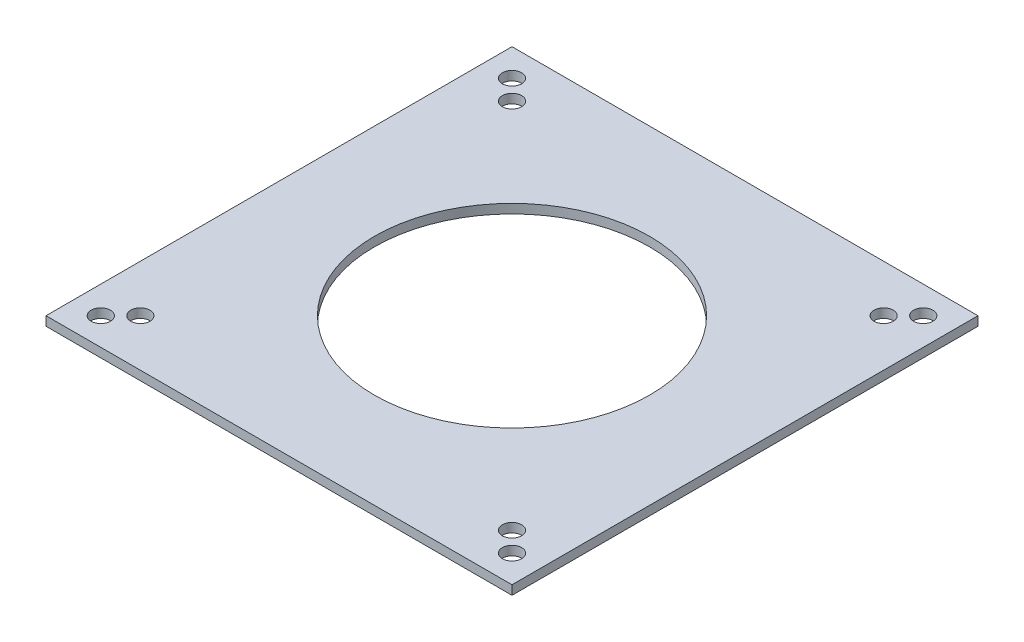
ISO-10303-21;
HEADER;
FILE_DESCRIPTION(('STEP AP214'),'2;1');
FILE_NAME('part.step','',(''),(''),'','','');
FILE_SCHEMA(('AUTOMOTIVE_DESIGN { 1 0 10303 214 1 1 1 1 }'));
ENDSEC;
DATA;
#1=APPLICATION_CONTEXT('core data for automotive mechanical design processes');
#2=APPLICATION_PROTOCOL_DEFINITION('international standard','automotive_design',2000,#1);
#3=PRODUCT_CONTEXT('',#1,'mechanical');
#4=PRODUCT('Part','Part','',(#3));
#5=PRODUCT_RELATED_PRODUCT_CATEGORY('part','',(#4));
#6=PRODUCT_DEFINITION_FORMATION('','',#4);
#7=PRODUCT_DEFINITION_CONTEXT('part definition',#1,'design');
#8=PRODUCT_DEFINITION('design','',#6,#7);
#9=PRODUCT_DEFINITION_SHAPE('','',#8);
#10=(LENGTH_UNIT() NAMED_UNIT(*) SI_UNIT(.MILLI.,.METRE.));
#11=(NAMED_UNIT(*) PLANE_ANGLE_UNIT() SI_UNIT($,.RADIAN.));
#12=(NAMED_UNIT(*) SI_UNIT($,.STERADIAN.) SOLID_ANGLE_UNIT());
#13=UNCERTAINTY_MEASURE_WITH_UNIT(LENGTH_MEASURE(1.E-05),#10,'distance_accuracy_value','');
#14=(GEOMETRIC_REPRESENTATION_CONTEXT(3) GLOBAL_UNCERTAINTY_ASSIGNED_CONTEXT((#13)) GLOBAL_UNIT_ASSIGNED_CONTEXT((#10,
#11,#12)) REPRESENTATION_CONTEXT('',''));
#15=CARTESIAN_POINT('',(0.,0.,0.));
#16=DIRECTION('',(0.,0.,1.));
#17=DIRECTION('',(1.,0.,0.));
#18=AXIS2_PLACEMENT_3D('',#15,#16,#17);
#19=CARTESIAN_POINT('',(0.,2.,0.));
#20=DIRECTION('',(0.,-1.,0.));
#21=DIRECTION('',(0.,0.,-1.));
#22=AXIS2_PLACEMENT_3D('',#19,#20,#21);
#23=PLANE('',#22);
#24=DIRECTION('',(0.,0.,-1.));
#25=VECTOR('',#24,1.);
#26=CARTESIAN_POINT('',(50.8,2.,50.8));
#27=LINE('',#26,#25);
#28=CARTESIAN_POINT('',(50.8,2.,50.8));
#29=VERTEX_POINT('',#28);
#30=CARTESIAN_POINT('',(50.8,2.,-50.8));
#31=VERTEX_POINT('',#30);
#32=EDGE_CURVE('E88',#29,#31,#27,.T.);
#33=ORIENTED_EDGE('',*,*,#32,.T.);
#34=DIRECTION('',(-1.,0.,0.));
#35=VECTOR('',#34,1.);
#36=CARTESIAN_POINT('',(-50.8,2.,-50.8));
#37=LINE('',#36,#35);
#38=CARTESIAN_POINT('',(-50.8,2.,-50.8));
#39=VERTEX_POINT('',#38);
#40=EDGE_CURVE('E83',#31,#39,#37,.T.);
#41=ORIENTED_EDGE('',*,*,#40,.T.);
#42=DIRECTION('',(0.,0.,1.));
#43=VECTOR('',#42,1.);
#44=CARTESIAN_POINT('',(-50.8,2.,50.8));
#45=LINE('',#44,#43);
#46=CARTESIAN_POINT('',(-50.8,2.,50.8));
#47=VERTEX_POINT('',#46);
#48=EDGE_CURVE('E86',#39,#47,#45,.T.);
#49=ORIENTED_EDGE('',*,*,#48,.T.);
#50=DIRECTION('',(1.,0.,0.));
#51=VECTOR('',#50,1.);
#52=CARTESIAN_POINT('',(-50.8,2.,50.8));
#53=LINE('',#52,#51);
#54=EDGE_CURVE('E53',#47,#29,#53,.T.);
#55=ORIENTED_EDGE('',*,*,#54,.T.);
#56=EDGE_LOOP('',(#33,#41,#49,#55));
#57=FACE_BOUND('',#56,.T.);
#58=CARTESIAN_POINT('',(-44.831,2.,-44.831));
#59=DIRECTION('',(0.,1.,0.));
#60=DIRECTION('',(0.,0.,1.));
#61=AXIS2_PLACEMENT_3D('',#58,#59,#60);
#62=CIRCLE('',#61,2.1);
#63=CARTESIAN_POINT('',(-44.831,2.,-42.731));
#64=VERTEX_POINT('',#63);
#65=EDGE_CURVE('E103',#64,#64,#62,.T.);
#66=ORIENTED_EDGE('',*,*,#65,.F.);
#67=EDGE_LOOP('',(#66));
#68=FACE_BOUND('',#67,.T.);
#69=CARTESIAN_POINT('',(-40.513,2.,-40.513));
#70=DIRECTION('',(0.,1.,0.));
#71=DIRECTION('',(0.,0.,1.));
#72=AXIS2_PLACEMENT_3D('',#69,#70,#71);
#73=CIRCLE('',#72,2.1);
#74=CARTESIAN_POINT('',(-40.513,2.,-38.413));
#75=VERTEX_POINT('',#74);
#76=EDGE_CURVE('E118',#75,#75,#73,.T.);
#77=ORIENTED_EDGE('',*,*,#76,.F.);
#78=EDGE_LOOP('',(#77));
#79=FACE_BOUND('',#78,.T.);
#80=CARTESIAN_POINT('',(44.831,2.,-44.831));
#81=DIRECTION('',(0.,1.,0.));
#82=DIRECTION('',(0.,0.,1.));
#83=AXIS2_PLACEMENT_3D('',#80,#81,#82);
#84=CIRCLE('',#83,2.1);
#85=CARTESIAN_POINT('',(44.831,2.,-42.731));
#86=VERTEX_POINT('',#85);
#87=EDGE_CURVE('E124',#86,#86,#84,.T.);
#88=ORIENTED_EDGE('',*,*,#87,.F.);
#89=EDGE_LOOP('',(#88));
#90=FACE_BOUND('',#89,.T.);
#91=CARTESIAN_POINT('',(40.513,2.,-40.513));
#92=DIRECTION('',(0.,1.,0.));
#93=DIRECTION('',(0.,0.,1.));
#94=AXIS2_PLACEMENT_3D('',#91,#92,#93);
#95=CIRCLE('',#94,2.1);
#96=CARTESIAN_POINT('',(40.513,2.,-38.413));
#97=VERTEX_POINT('',#96);
#98=EDGE_CURVE('E130',#97,#97,#95,.T.);
#99=ORIENTED_EDGE('',*,*,#98,.F.);
#100=EDGE_LOOP('',(#99));
#101=FACE_BOUND('',#100,.T.);
#102=CARTESIAN_POINT('',(44.831,2.,44.831));
#103=DIRECTION('',(0.,1.,0.));
#104=DIRECTION('',(0.,0.,1.));
#105=AXIS2_PLACEMENT_3D('',#102,#103,#104);
#106=CIRCLE('',#105,2.1);
#107=CARTESIAN_POINT('',(44.831,2.,46.931));
#108=VERTEX_POINT('',#107);
#109=EDGE_CURVE('E136',#108,#108,#106,.T.);
#110=ORIENTED_EDGE('',*,*,#109,.F.);
#111=EDGE_LOOP('',(#110));
#112=FACE_BOUND('',#111,.T.);
#113=CARTESIAN_POINT('',(40.513,2.,40.513));
#114=DIRECTION('',(0.,1.,0.));
#115=DIRECTION('',(0.,0.,1.));
#116=AXIS2_PLACEMENT_3D('',#113,#114,#115);
#117=CIRCLE('',#116,2.1);
#118=CARTESIAN_POINT('',(40.513,2.,42.613));
#119=VERTEX_POINT('',#118);
#120=EDGE_CURVE('E142',#119,#119,#117,.T.);
#121=ORIENTED_EDGE('',*,*,#120,.F.);
#122=EDGE_LOOP('',(#121));
#123=FACE_BOUND('',#122,.T.);
#124=CARTESIAN_POINT('',(-40.513,2.,40.513));
#125=DIRECTION('',(0.,1.,0.));
#126=DIRECTION('',(0.,0.,1.));
#127=AXIS2_PLACEMENT_3D('',#124,#125,#126);
#128=CIRCLE('',#127,2.1);
#129=CARTESIAN_POINT('',(-40.513,2.,42.613));
#130=VERTEX_POINT('',#129);
#131=EDGE_CURVE('E148',#130,#130,#128,.T.);
#132=ORIENTED_EDGE('',*,*,#131,.F.);
#133=EDGE_LOOP('',(#132));
#134=FACE_BOUND('',#133,.T.);
#135=CARTESIAN_POINT('',(-44.831,2.,44.831));
#136=DIRECTION('',(0.,1.,0.));
#137=DIRECTION('',(0.,0.,1.));
#138=AXIS2_PLACEMENT_3D('',#135,#136,#137);
#139=CIRCLE('',#138,2.1);
#140=CARTESIAN_POINT('',(-44.831,2.,46.931));
#141=VERTEX_POINT('',#140);
#142=EDGE_CURVE('E154',#141,#141,#139,.T.);
#143=ORIENTED_EDGE('',*,*,#142,.F.);
#144=EDGE_LOOP('',(#143));
#145=FACE_BOUND('',#144,.T.);
#146=CARTESIAN_POINT('',(0.,2.,0.));
#147=DIRECTION('',(0.,1.,0.));
#148=DIRECTION('',(0.,0.,1.));
#149=AXIS2_PLACEMENT_3D('',#146,#147,#148);
#150=CIRCLE('',#149,30.);
#151=CARTESIAN_POINT('',(0.,2.,30.));
#152=VERTEX_POINT('',#151);
#153=EDGE_CURVE('E160',#152,#152,#150,.T.);
#154=ORIENTED_EDGE('',*,*,#153,.F.);
#155=EDGE_LOOP('',(#154));
#156=FACE_BOUND('',#155,.T.);
#157=ADVANCED_FACE('F36',(#57,#68,#79,#90,#101,#112,#123,#134,#145,#156),#23,.F.);
#158=CARTESIAN_POINT('',(0.,0.,0.));
#159=DIRECTION('',(0.,-1.,0.));
#160=DIRECTION('',(0.,0.,-1.));
#161=AXIS2_PLACEMENT_3D('',#158,#159,#160);
#162=PLANE('',#161);
#163=CARTESIAN_POINT('',(-44.831,0.,44.831));
#164=DIRECTION('',(0.,1.,0.));
#165=DIRECTION('',(0.,0.,1.));
#166=AXIS2_PLACEMENT_3D('',#163,#164,#165);
#167=CIRCLE('',#166,2.1);
#168=CARTESIAN_POINT('',(-44.831,0.,46.931));
#169=VERTEX_POINT('',#168);
#170=EDGE_CURVE('E157',#169,#169,#167,.T.);
#171=ORIENTED_EDGE('',*,*,#170,.T.);
#172=EDGE_LOOP('',(#171));
#173=FACE_BOUND('',#172,.T.);
#174=CARTESIAN_POINT('',(40.513,0.,40.513));
#175=DIRECTION('',(0.,1.,0.));
#176=DIRECTION('',(0.,0.,1.));
#177=AXIS2_PLACEMENT_3D('',#174,#175,#176);
#178=CIRCLE('',#177,2.1);
#179=CARTESIAN_POINT('',(40.513,0.,42.613));
#180=VERTEX_POINT('',#179);
#181=EDGE_CURVE('E145',#180,#180,#178,.T.);
#182=ORIENTED_EDGE('',*,*,#181,.T.);
#183=EDGE_LOOP('',(#182));
#184=FACE_BOUND('',#183,.T.);
#185=CARTESIAN_POINT('',(40.513,0.,-40.513));
#186=DIRECTION('',(0.,1.,0.));
#187=DIRECTION('',(0.,0.,1.));
#188=AXIS2_PLACEMENT_3D('',#185,#186,#187);
#189=CIRCLE('',#188,2.1);
#190=CARTESIAN_POINT('',(40.513,0.,-38.413));
#191=VERTEX_POINT('',#190);
#192=EDGE_CURVE('E133',#191,#191,#189,.T.);
#193=ORIENTED_EDGE('',*,*,#192,.T.);
#194=EDGE_LOOP('',(#193));
#195=FACE_BOUND('',#194,.T.);
#196=CARTESIAN_POINT('',(-40.513,0.,-40.513));
#197=DIRECTION('',(0.,1.,0.));
#198=DIRECTION('',(0.,0.,1.));
#199=AXIS2_PLACEMENT_3D('',#196,#197,#198);
#200=CIRCLE('',#199,2.1);
#201=CARTESIAN_POINT('',(-40.513,0.,-38.413));
#202=VERTEX_POINT('',#201);
#203=EDGE_CURVE('E121',#202,#202,#200,.T.);
#204=ORIENTED_EDGE('',*,*,#203,.T.);
#205=EDGE_LOOP('',(#204));
#206=FACE_BOUND('',#205,.T.);
#207=DIRECTION('',(0.,0.,-1.));
#208=VECTOR('',#207,1.);
#209=CARTESIAN_POINT('',(50.8,0.,50.8));
#210=LINE('',#209,#208);
#211=CARTESIAN_POINT('',(50.8,0.,50.8));
#212=VERTEX_POINT('',#211);
#213=CARTESIAN_POINT('',(50.8,0.,-50.8));
#214=VERTEX_POINT('',#213);
#215=EDGE_CURVE('E100',#212,#214,#210,.T.);
#216=ORIENTED_EDGE('',*,*,#215,.F.);
#217=DIRECTION('',(1.,0.,0.));
#218=VECTOR('',#217,1.);
#219=CARTESIAN_POINT('',(-50.8,0.,50.8));
#220=LINE('',#219,#218);
#221=CARTESIAN_POINT('',(-50.8,0.,50.8));
#222=VERTEX_POINT('',#221);
#223=EDGE_CURVE('E76',#222,#212,#220,.T.);
#224=ORIENTED_EDGE('',*,*,#223,.F.);
#225=DIRECTION('',(0.,0.,1.));
#226=VECTOR('',#225,1.);
#227=CARTESIAN_POINT('',(-50.8,0.,50.8));
#228=LINE('',#227,#226);
#229=CARTESIAN_POINT('',(-50.8,0.,-50.8));
#230=VERTEX_POINT('',#229);
#231=EDGE_CURVE('E70',#230,#222,#228,.T.);
#232=ORIENTED_EDGE('',*,*,#231,.F.);
#233=DIRECTION('',(-1.,0.,0.));
#234=VECTOR('',#233,1.);
#235=CARTESIAN_POINT('',(-50.8,0.,-50.8));
#236=LINE('',#235,#234);
#237=EDGE_CURVE('E92',#214,#230,#236,.T.);
#238=ORIENTED_EDGE('',*,*,#237,.F.);
#239=EDGE_LOOP('',(#216,#224,#232,#238));
#240=FACE_BOUND('',#239,.T.);
#241=CARTESIAN_POINT('',(-44.831,0.,-44.831));
#242=DIRECTION('',(0.,1.,0.));
#243=DIRECTION('',(0.,0.,1.));
#244=AXIS2_PLACEMENT_3D('',#241,#242,#243);
#245=CIRCLE('',#244,2.1);
#246=CARTESIAN_POINT('',(-44.831,0.,-42.731));
#247=VERTEX_POINT('',#246);
#248=EDGE_CURVE('E115',#247,#247,#245,.T.);
#249=ORIENTED_EDGE('',*,*,#248,.T.);
#250=EDGE_LOOP('',(#249));
#251=FACE_BOUND('',#250,.T.);
#252=CARTESIAN_POINT('',(44.831,0.,-44.831));
#253=DIRECTION('',(0.,1.,0.));
#254=DIRECTION('',(0.,0.,1.));
#255=AXIS2_PLACEMENT_3D('',#252,#253,#254);
#256=CIRCLE('',#255,2.1);
#257=CARTESIAN_POINT('',(44.831,0.,-42.731));
#258=VERTEX_POINT('',#257);
#259=EDGE_CURVE('E127',#258,#258,#256,.T.);
#260=ORIENTED_EDGE('',*,*,#259,.T.);
#261=EDGE_LOOP('',(#260));
#262=FACE_BOUND('',#261,.T.);
#263=CARTESIAN_POINT('',(44.831,0.,44.831));
#264=DIRECTION('',(0.,1.,0.));
#265=DIRECTION('',(0.,0.,1.));
#266=AXIS2_PLACEMENT_3D('',#263,#264,#265);
#267=CIRCLE('',#266,2.1);
#268=CARTESIAN_POINT('',(44.831,0.,46.931));
#269=VERTEX_POINT('',#268);
#270=EDGE_CURVE('E139',#269,#269,#267,.T.);
#271=ORIENTED_EDGE('',*,*,#270,.T.);
#272=EDGE_LOOP('',(#271));
#273=FACE_BOUND('',#272,.T.);
#274=CARTESIAN_POINT('',(-40.513,0.,40.513));
#275=DIRECTION('',(0.,1.,0.));
#276=DIRECTION('',(0.,0.,1.));
#277=AXIS2_PLACEMENT_3D('',#274,#275,#276);
#278=CIRCLE('',#277,2.1);
#279=CARTESIAN_POINT('',(-40.513,0.,42.613));
#280=VERTEX_POINT('',#279);
#281=EDGE_CURVE('E151',#280,#280,#278,.T.);
#282=ORIENTED_EDGE('',*,*,#281,.T.);
#283=EDGE_LOOP('',(#282));
#284=FACE_BOUND('',#283,.T.);
#285=CARTESIAN_POINT('',(0.,0.,0.));
#286=DIRECTION('',(0.,1.,0.));
#287=DIRECTION('',(0.,0.,1.));
#288=AXIS2_PLACEMENT_3D('',#285,#286,#287);
#289=CIRCLE('',#288,30.);
#290=CARTESIAN_POINT('',(0.,0.,30.));
#291=VERTEX_POINT('',#290);
#292=EDGE_CURVE('E163',#291,#291,#289,.T.);
#293=ORIENTED_EDGE('',*,*,#292,.T.);
#294=EDGE_LOOP('',(#293));
#295=FACE_BOUND('',#294,.T.);
#296=ADVANCED_FACE('F111',(#173,#184,#195,#206,#240,#251,#262,#273,#284,#295),#162,.T.);
#297=CARTESIAN_POINT('',(50.8,2.,50.8));
#298=DIRECTION('',(-1.,0.,0.));
#299=DIRECTION('',(0.,0.,1.));
#300=AXIS2_PLACEMENT_3D('',#297,#298,#299);
#301=PLANE('',#300);
#302=ORIENTED_EDGE('',*,*,#215,.T.);
#303=DIRECTION('',(0.,-1.,0.));
#304=VECTOR('',#303,1.);
#305=CARTESIAN_POINT('',(50.8,2.,-50.8));
#306=LINE('',#305,#304);
#307=EDGE_CURVE('E11',#31,#214,#306,.T.);
#308=ORIENTED_EDGE('',*,*,#307,.F.);
#309=ORIENTED_EDGE('',*,*,#32,.F.);
#310=DIRECTION('',(0.,-1.,0.));
#311=VECTOR('',#310,1.);
#312=CARTESIAN_POINT('',(50.8,2.,50.8));
#313=LINE('',#312,#311);
#314=EDGE_CURVE('E96',#29,#212,#313,.T.);
#315=ORIENTED_EDGE('',*,*,#314,.T.);
#316=EDGE_LOOP('',(#302,#308,#309,#315));
#317=FACE_BOUND('',#316,.T.);
#318=ADVANCED_FACE('F38',(#317),#301,.F.);
#319=CARTESIAN_POINT('',(-50.8,2.,-50.8));
#320=DIRECTION('',(0.,0.,1.));
#321=DIRECTION('',(1.,0.,0.));
#322=AXIS2_PLACEMENT_3D('',#319,#320,#321);
#323=PLANE('',#322);
#324=ORIENTED_EDGE('',*,*,#237,.T.);
#325=DIRECTION('',(0.,-1.,0.));
#326=VECTOR('',#325,1.);
#327=CARTESIAN_POINT('',(-50.8,2.,-50.8));
#328=LINE('',#327,#326);
#329=EDGE_CURVE('E45',#39,#230,#328,.T.);
#330=ORIENTED_EDGE('',*,*,#329,.F.);
#331=ORIENTED_EDGE('',*,*,#40,.F.);
#332=ORIENTED_EDGE('',*,*,#307,.T.);
#333=EDGE_LOOP('',(#324,#330,#331,#332));
#334=FACE_BOUND('',#333,.T.);
#335=ADVANCED_FACE('F91',(#334),#323,.F.);
#336=CARTESIAN_POINT('',(-50.8,2.,50.8));
#337=DIRECTION('',(1.,0.,0.));
#338=DIRECTION('',(0.,0.,-1.));
#339=AXIS2_PLACEMENT_3D('',#336,#337,#338);
#340=PLANE('',#339);
#341=ORIENTED_EDGE('',*,*,#231,.T.);
#342=DIRECTION('',(0.,-1.,0.));
#343=VECTOR('',#342,1.);
#344=CARTESIAN_POINT('',(-50.8,2.,50.8));
#345=LINE('',#344,#343);
#346=EDGE_CURVE('E93',#47,#222,#345,.T.);
#347=ORIENTED_EDGE('',*,*,#346,.F.);
#348=ORIENTED_EDGE('',*,*,#48,.F.);
#349=ORIENTED_EDGE('',*,*,#329,.T.);
#350=EDGE_LOOP('',(#341,#347,#348,#349));
#351=FACE_BOUND('',#350,.T.);
#352=ADVANCED_FACE('F94',(#351),#340,.F.);
#353=CARTESIAN_POINT('',(-50.8,2.,50.8));
#354=DIRECTION('',(0.,0.,-1.));
#355=DIRECTION('',(-1.,0.,0.));
#356=AXIS2_PLACEMENT_3D('',#353,#354,#355);
#357=PLANE('',#356);
#358=ORIENTED_EDGE('',*,*,#223,.T.);
#359=ORIENTED_EDGE('',*,*,#314,.F.);
#360=ORIENTED_EDGE('',*,*,#54,.F.);
#361=ORIENTED_EDGE('',*,*,#346,.T.);
#362=EDGE_LOOP('',(#358,#359,#360,#361));
#363=FACE_BOUND('',#362,.T.);
#364=ADVANCED_FACE('F108',(#363),#357,.F.);
#365=CARTESIAN_POINT('',(-44.831,2.,-44.831));
#366=DIRECTION('',(0.,-1.,0.));
#367=DIRECTION('',(0.,0.,-1.));
#368=AXIS2_PLACEMENT_3D('',#365,#366,#367);
#369=CYLINDRICAL_SURFACE('',#368,2.1);
#370=ORIENTED_EDGE('',*,*,#65,.T.);
#371=EDGE_LOOP('',(#370));
#372=FACE_BOUND('',#371,.T.);
#373=ORIENTED_EDGE('',*,*,#248,.F.);
#374=EDGE_LOOP('',(#373));
#375=FACE_BOUND('',#374,.T.);
#376=ADVANCED_FACE('F180',(#372,#375),#369,.F.);
#377=CARTESIAN_POINT('',(-40.513,2.,-40.513));
#378=DIRECTION('',(0.,-1.,0.));
#379=DIRECTION('',(0.,0.,-1.));
#380=AXIS2_PLACEMENT_3D('',#377,#378,#379);
#381=CYLINDRICAL_SURFACE('',#380,2.1);
#382=ORIENTED_EDGE('',*,*,#76,.T.);
#383=EDGE_LOOP('',(#382));
#384=FACE_BOUND('',#383,.T.);
#385=ORIENTED_EDGE('',*,*,#203,.F.);
#386=EDGE_LOOP('',(#385));
#387=FACE_BOUND('',#386,.T.);
#388=ADVANCED_FACE('F226',(#384,#387),#381,.F.);
#389=CARTESIAN_POINT('',(44.831,2.,-44.831));
#390=DIRECTION('',(0.,-1.,0.));
#391=DIRECTION('',(0.,0.,-1.));
#392=AXIS2_PLACEMENT_3D('',#389,#390,#391);
#393=CYLINDRICAL_SURFACE('',#392,2.1);
#394=ORIENTED_EDGE('',*,*,#87,.T.);
#395=EDGE_LOOP('',(#394));
#396=FACE_BOUND('',#395,.T.);
#397=ORIENTED_EDGE('',*,*,#259,.F.);
#398=EDGE_LOOP('',(#397));
#399=FACE_BOUND('',#398,.T.);
#400=ADVANCED_FACE('F234',(#396,#399),#393,.F.);
#401=CARTESIAN_POINT('',(40.513,2.,-40.513));
#402=DIRECTION('',(0.,-1.,0.));
#403=DIRECTION('',(0.,0.,-1.));
#404=AXIS2_PLACEMENT_3D('',#401,#402,#403);
#405=CYLINDRICAL_SURFACE('',#404,2.1);
#406=ORIENTED_EDGE('',*,*,#98,.T.);
#407=EDGE_LOOP('',(#406));
#408=FACE_BOUND('',#407,.T.);
#409=ORIENTED_EDGE('',*,*,#192,.F.);
#410=EDGE_LOOP('',(#409));
#411=FACE_BOUND('',#410,.T.);
#412=ADVANCED_FACE('F242',(#408,#411),#405,.F.);
#413=CARTESIAN_POINT('',(44.831,2.,44.831));
#414=DIRECTION('',(0.,-1.,0.));
#415=DIRECTION('',(0.,0.,-1.));
#416=AXIS2_PLACEMENT_3D('',#413,#414,#415);
#417=CYLINDRICAL_SURFACE('',#416,2.1);
#418=ORIENTED_EDGE('',*,*,#109,.T.);
#419=EDGE_LOOP('',(#418));
#420=FACE_BOUND('',#419,.T.);
#421=ORIENTED_EDGE('',*,*,#270,.F.);
#422=EDGE_LOOP('',(#421));
#423=FACE_BOUND('',#422,.T.);
#424=ADVANCED_FACE('F251',(#420,#423),#417,.F.);
#425=CARTESIAN_POINT('',(40.513,2.,40.513));
#426=DIRECTION('',(0.,-1.,0.));
#427=DIRECTION('',(0.,0.,-1.));
#428=AXIS2_PLACEMENT_3D('',#425,#426,#427);
#429=CYLINDRICAL_SURFACE('',#428,2.1);
#430=ORIENTED_EDGE('',*,*,#120,.T.);
#431=EDGE_LOOP('',(#430));
#432=FACE_BOUND('',#431,.T.);
#433=ORIENTED_EDGE('',*,*,#181,.F.);
#434=EDGE_LOOP('',(#433));
#435=FACE_BOUND('',#434,.T.);
#436=ADVANCED_FACE('F260',(#432,#435),#429,.F.);
#437=CARTESIAN_POINT('',(-40.513,2.,40.513));
#438=DIRECTION('',(0.,-1.,0.));
#439=DIRECTION('',(0.,0.,-1.));
#440=AXIS2_PLACEMENT_3D('',#437,#438,#439);
#441=CYLINDRICAL_SURFACE('',#440,2.1);
#442=ORIENTED_EDGE('',*,*,#131,.T.);
#443=EDGE_LOOP('',(#442));
#444=FACE_BOUND('',#443,.T.);
#445=ORIENTED_EDGE('',*,*,#281,.F.);
#446=EDGE_LOOP('',(#445));
#447=FACE_BOUND('',#446,.T.);
#448=ADVANCED_FACE('F269',(#444,#447),#441,.F.);
#449=CARTESIAN_POINT('',(-44.831,2.,44.831));
#450=DIRECTION('',(0.,-1.,0.));
#451=DIRECTION('',(0.,0.,-1.));
#452=AXIS2_PLACEMENT_3D('',#449,#450,#451);
#453=CYLINDRICAL_SURFACE('',#452,2.1);
#454=ORIENTED_EDGE('',*,*,#142,.T.);
#455=EDGE_LOOP('',(#454));
#456=FACE_BOUND('',#455,.T.);
#457=ORIENTED_EDGE('',*,*,#170,.F.);
#458=EDGE_LOOP('',(#457));
#459=FACE_BOUND('',#458,.T.);
#460=ADVANCED_FACE('F278',(#456,#459),#453,.F.);
#461=CARTESIAN_POINT('',(0.,2.,0.));
#462=DIRECTION('',(0.,-1.,0.));
#463=DIRECTION('',(0.,0.,-1.));
#464=AXIS2_PLACEMENT_3D('',#461,#462,#463);
#465=CYLINDRICAL_SURFACE('',#464,30.);
#466=ORIENTED_EDGE('',*,*,#153,.T.);
#467=EDGE_LOOP('',(#466));
#468=FACE_BOUND('',#467,.T.);
#469=ORIENTED_EDGE('',*,*,#292,.F.);
#470=EDGE_LOOP('',(#469));
#471=FACE_BOUND('',#470,.T.);
#472=ADVANCED_FACE('F169',(#468,#471),#465,.F.);
#473=CLOSED_SHELL('',(#157,#296,#318,#335,#352,#364,#376,#388,#400,#412,#424,#436,#448,#460,#472));
#474=MANIFOLD_SOLID_BREP('B2',#473);
#475=ADVANCED_BREP_SHAPE_REPRESENTATION('',(#18,#474),#14);
#476=SHAPE_DEFINITION_REPRESENTATION(#9,#475);
ENDSEC;
END-ISO-10303-21;
